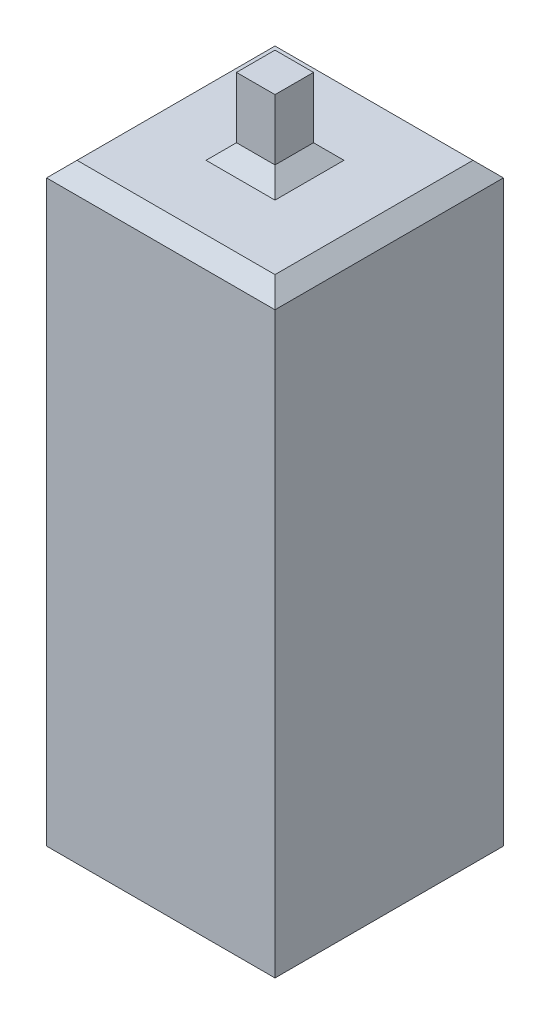
ISO-10303-21;
HEADER;
FILE_DESCRIPTION(('STEP AP214'),'2;1');
FILE_NAME('part.step','',(''),(''),'','','');
FILE_SCHEMA(('AUTOMOTIVE_DESIGN { 1 0 10303 214 1 1 1 1 }'));
ENDSEC;
DATA;
#1=APPLICATION_CONTEXT('core data for automotive mechanical design processes');
#2=APPLICATION_PROTOCOL_DEFINITION('international standard','automotive_design',2000,#1);
#3=PRODUCT_CONTEXT('',#1,'mechanical');
#4=PRODUCT('Part','Part','',(#3));
#5=PRODUCT_RELATED_PRODUCT_CATEGORY('part','',(#4));
#6=PRODUCT_DEFINITION_FORMATION('','',#4);
#7=PRODUCT_DEFINITION_CONTEXT('part definition',#1,'design');
#8=PRODUCT_DEFINITION('design','',#6,#7);
#9=PRODUCT_DEFINITION_SHAPE('','',#8);
#10=(LENGTH_UNIT() NAMED_UNIT(*) SI_UNIT(.MILLI.,.METRE.));
#11=(NAMED_UNIT(*) PLANE_ANGLE_UNIT() SI_UNIT($,.RADIAN.));
#12=(NAMED_UNIT(*) SI_UNIT($,.STERADIAN.) SOLID_ANGLE_UNIT());
#13=UNCERTAINTY_MEASURE_WITH_UNIT(LENGTH_MEASURE(1.E-05),#10,'distance_accuracy_value','');
#14=(GEOMETRIC_REPRESENTATION_CONTEXT(3) GLOBAL_UNCERTAINTY_ASSIGNED_CONTEXT((#13)) GLOBAL_UNIT_ASSIGNED_CONTEXT((#10,
#11,#12)) REPRESENTATION_CONTEXT('',''));
#15=CARTESIAN_POINT('',(0.,0.,0.));
#16=DIRECTION('',(0.,0.,1.));
#17=DIRECTION('',(1.,0.,0.));
#18=AXIS2_PLACEMENT_3D('',#15,#16,#17);
#19=CARTESIAN_POINT('',(150.,800.,-150.));
#20=DIRECTION('',(-1.,0.,0.));
#21=DIRECTION('',(0.,0.,1.));
#22=AXIS2_PLACEMENT_3D('',#19,#20,#21);
#23=PLANE('',#22);
#24=DIRECTION('',(0.,-1.,0.));
#25=VECTOR('',#24,1.);
#26=CARTESIAN_POINT('',(150.,800.,150.));
#27=LINE('',#26,#25);
#28=CARTESIAN_POINT('',(150.,780.,150.));
#29=VERTEX_POINT('',#28);
#30=CARTESIAN_POINT('',(150.,20.0000000000001,150.));
#31=VERTEX_POINT('',#30);
#32=EDGE_CURVE('E159',#29,#31,#27,.T.);
#33=ORIENTED_EDGE('',*,*,#32,.T.);
#34=DIRECTION('',(0.,0.,-1.));
#35=VECTOR('',#34,1.);
#36=CARTESIAN_POINT('',(150.,20.0000000000001,-150.));
#37=LINE('',#36,#35);
#38=CARTESIAN_POINT('',(150.,20.0000000000001,-150.));
#39=VERTEX_POINT('',#38);
#40=EDGE_CURVE('E201',#31,#39,#37,.T.);
#41=ORIENTED_EDGE('',*,*,#40,.T.);
#42=DIRECTION('',(0.,-1.,0.));
#43=VECTOR('',#42,1.);
#44=CARTESIAN_POINT('',(150.,800.,-150.));
#45=LINE('',#44,#43);
#46=CARTESIAN_POINT('',(150.,780.,-150.));
#47=VERTEX_POINT('',#46);
#48=EDGE_CURVE('E173',#47,#39,#45,.T.);
#49=ORIENTED_EDGE('',*,*,#48,.F.);
#50=DIRECTION('',(0.,0.,1.));
#51=VECTOR('',#50,1.);
#52=CARTESIAN_POINT('',(150.,780.,150.));
#53=LINE('',#52,#51);
#54=EDGE_CURVE('E199',#47,#29,#53,.T.);
#55=ORIENTED_EDGE('',*,*,#54,.T.);
#56=EDGE_LOOP('',(#33,#41,#49,#55));
#57=FACE_BOUND('',#56,.T.);
#58=ADVANCED_FACE('F33',(#57),#23,.F.);
#59=CARTESIAN_POINT('',(-150.,800.,-150.));
#60=DIRECTION('',(0.,0.,1.));
#61=DIRECTION('',(1.,0.,0.));
#62=AXIS2_PLACEMENT_3D('',#59,#60,#61);
#63=PLANE('',#62);
#64=ORIENTED_EDGE('',*,*,#48,.T.);
#65=DIRECTION('',(-1.,0.,0.));
#66=VECTOR('',#65,1.);
#67=CARTESIAN_POINT('',(-150.,20.0000000000001,-150.));
#68=LINE('',#67,#66);
#69=CARTESIAN_POINT('',(-150.,20.0000000000001,-150.));
#70=VERTEX_POINT('',#69);
#71=EDGE_CURVE('E178',#39,#70,#68,.T.);
#72=ORIENTED_EDGE('',*,*,#71,.T.);
#73=DIRECTION('',(0.,-1.,0.));
#74=VECTOR('',#73,1.);
#75=CARTESIAN_POINT('',(-150.,800.,-150.));
#76=LINE('',#75,#74);
#77=CARTESIAN_POINT('',(-150.,780.,-150.));
#78=VERTEX_POINT('',#77);
#79=EDGE_CURVE('E170',#78,#70,#76,.T.);
#80=ORIENTED_EDGE('',*,*,#79,.F.);
#81=DIRECTION('',(1.,0.,0.));
#82=VECTOR('',#81,1.);
#83=CARTESIAN_POINT('',(150.,780.,-150.));
#84=LINE('',#83,#82);
#85=EDGE_CURVE('E176',#78,#47,#84,.T.);
#86=ORIENTED_EDGE('',*,*,#85,.T.);
#87=EDGE_LOOP('',(#64,#72,#80,#86));
#88=FACE_BOUND('',#87,.T.);
#89=ADVANCED_FACE('F283',(#88),#63,.F.);
#90=CARTESIAN_POINT('',(-150.,800.,-150.));
#91=DIRECTION('',(1.,0.,0.));
#92=DIRECTION('',(0.,0.,-1.));
#93=AXIS2_PLACEMENT_3D('',#90,#91,#92);
#94=PLANE('',#93);
#95=ORIENTED_EDGE('',*,*,#79,.T.);
#96=DIRECTION('',(0.,0.,1.));
#97=VECTOR('',#96,1.);
#98=CARTESIAN_POINT('',(-150.,20.0000000000001,-150.));
#99=LINE('',#98,#97);
#100=CARTESIAN_POINT('',(-150.,20.0000000000001,150.));
#101=VERTEX_POINT('',#100);
#102=EDGE_CURVE('E192',#70,#101,#99,.T.);
#103=ORIENTED_EDGE('',*,*,#102,.T.);
#104=DIRECTION('',(0.,-1.,0.));
#105=VECTOR('',#104,1.);
#106=CARTESIAN_POINT('',(-150.,800.,150.));
#107=LINE('',#106,#105);
#108=CARTESIAN_POINT('',(-150.,780.,150.));
#109=VERTEX_POINT('',#108);
#110=EDGE_CURVE('E162',#109,#101,#107,.T.);
#111=ORIENTED_EDGE('',*,*,#110,.F.);
#112=DIRECTION('',(0.,0.,-1.));
#113=VECTOR('',#112,1.);
#114=CARTESIAN_POINT('',(-150.,780.,-150.));
#115=LINE('',#114,#113);
#116=EDGE_CURVE('E190',#109,#78,#115,.T.);
#117=ORIENTED_EDGE('',*,*,#116,.T.);
#118=EDGE_LOOP('',(#95,#103,#111,#117));
#119=FACE_BOUND('',#118,.T.);
#120=ADVANCED_FACE('F289',(#119),#94,.F.);
#121=CARTESIAN_POINT('',(-150.,800.,150.));
#122=DIRECTION('',(0.,0.,-1.));
#123=DIRECTION('',(-1.,0.,0.));
#124=AXIS2_PLACEMENT_3D('',#121,#122,#123);
#125=PLANE('',#124);
#126=ORIENTED_EDGE('',*,*,#110,.T.);
#127=DIRECTION('',(1.,0.,0.));
#128=VECTOR('',#127,1.);
#129=CARTESIAN_POINT('',(-150.,20.0000000000001,150.));
#130=LINE('',#129,#128);
#131=EDGE_CURVE('E197',#101,#31,#130,.T.);
#132=ORIENTED_EDGE('',*,*,#131,.T.);
#133=ORIENTED_EDGE('',*,*,#32,.F.);
#134=DIRECTION('',(-1.,0.,0.));
#135=VECTOR('',#134,1.);
#136=CARTESIAN_POINT('',(-150.,780.,150.));
#137=LINE('',#136,#135);
#138=EDGE_CURVE('E194',#29,#109,#137,.T.);
#139=ORIENTED_EDGE('',*,*,#138,.T.);
#140=EDGE_LOOP('',(#126,#132,#133,#139));
#141=FACE_BOUND('',#140,.T.);
#142=ADVANCED_FACE('F390',(#141),#125,.F.);
#143=CARTESIAN_POINT('',(0.,800.,0.));
#144=DIRECTION('',(0.,1.,0.));
#145=DIRECTION('',(0.,0.,1.));
#146=AXIS2_PLACEMENT_3D('',#143,#144,#145);
#147=PLANE('',#146);
#148=DIRECTION('',(0.,0.,1.));
#149=VECTOR('',#148,1.);
#150=CARTESIAN_POINT('',(-130.,800.,150.));
#151=LINE('',#150,#149);
#152=CARTESIAN_POINT('',(-130.,800.,-130.));
#153=VERTEX_POINT('',#152);
#154=CARTESIAN_POINT('',(-130.,800.,130.));
#155=VERTEX_POINT('',#154);
#156=EDGE_CURVE('E216',#153,#155,#151,.T.);
#157=ORIENTED_EDGE('',*,*,#156,.T.);
#158=DIRECTION('',(1.,0.,0.));
#159=VECTOR('',#158,1.);
#160=CARTESIAN_POINT('',(150.,800.,130.));
#161=LINE('',#160,#159);
#162=CARTESIAN_POINT('',(130.,800.,130.));
#163=VERTEX_POINT('',#162);
#164=EDGE_CURVE('E218',#155,#163,#161,.T.);
#165=ORIENTED_EDGE('',*,*,#164,.T.);
#166=DIRECTION('',(0.,0.,-1.));
#167=VECTOR('',#166,1.);
#168=CARTESIAN_POINT('',(130.,800.,-150.));
#169=LINE('',#168,#167);
#170=CARTESIAN_POINT('',(130.,800.,-130.));
#171=VERTEX_POINT('',#170);
#172=EDGE_CURVE('E212',#163,#171,#169,.T.);
#173=ORIENTED_EDGE('',*,*,#172,.T.);
#174=DIRECTION('',(-1.,0.,0.));
#175=VECTOR('',#174,1.);
#176=CARTESIAN_POINT('',(-150.,800.,-130.));
#177=LINE('',#176,#175);
#178=EDGE_CURVE('E214',#171,#153,#177,.T.);
#179=ORIENTED_EDGE('',*,*,#178,.T.);
#180=EDGE_LOOP('',(#157,#165,#173,#179));
#181=FACE_BOUND('',#180,.T.);
#182=DIRECTION('',(0.,0.,-1.));
#183=VECTOR('',#182,1.);
#184=CARTESIAN_POINT('',(-45.2983842453178,800.,0.));
#185=LINE('',#184,#183);
#186=CARTESIAN_POINT('',(-45.2983842453178,800.,45.2983842453178));
#187=VERTEX_POINT('',#186);
#188=CARTESIAN_POINT('',(-45.2983842453178,800.,-45.2983842453178));
#189=VERTEX_POINT('',#188);
#190=EDGE_CURVE('E207',#187,#189,#185,.T.);
#191=ORIENTED_EDGE('',*,*,#190,.T.);
#192=DIRECTION('',(1.,0.,0.));
#193=VECTOR('',#192,1.);
#194=CARTESIAN_POINT('',(0.,800.,-45.2983842453178));
#195=LINE('',#194,#193);
#196=CARTESIAN_POINT('',(45.2983842453178,800.,-45.2983842453178));
#197=VERTEX_POINT('',#196);
#198=EDGE_CURVE('E209',#189,#197,#195,.T.);
#199=ORIENTED_EDGE('',*,*,#198,.T.);
#200=DIRECTION('',(0.,0.,1.));
#201=VECTOR('',#200,1.);
#202=CARTESIAN_POINT('',(45.2983842453178,800.,0.));
#203=LINE('',#202,#201);
#204=CARTESIAN_POINT('',(45.2983842453178,800.,45.2983842453178));
#205=VERTEX_POINT('',#204);
#206=EDGE_CURVE('E203',#197,#205,#203,.T.);
#207=ORIENTED_EDGE('',*,*,#206,.T.);
#208=DIRECTION('',(-1.,0.,0.));
#209=VECTOR('',#208,1.);
#210=CARTESIAN_POINT('',(0.,800.,45.2983842453178));
#211=LINE('',#210,#209);
#212=EDGE_CURVE('E205',#205,#187,#211,.T.);
#213=ORIENTED_EDGE('',*,*,#212,.T.);
#214=EDGE_LOOP('',(#191,#199,#207,#213));
#215=FACE_BOUND('',#214,.T.);
#216=ADVANCED_FACE('F260',(#181,#215),#147,.T.);
#217=CARTESIAN_POINT('',(0.,0.,0.));
#218=DIRECTION('',(0.,1.,0.));
#219=DIRECTION('',(0.,0.,1.));
#220=AXIS2_PLACEMENT_3D('',#217,#218,#219);
#221=PLANE('',#220);
#222=DIRECTION('',(0.,0.,-1.));
#223=VECTOR('',#222,1.);
#224=CARTESIAN_POINT('',(-130.,0.,0.));
#225=LINE('',#224,#223);
#226=CARTESIAN_POINT('',(-130.,0.,130.));
#227=VERTEX_POINT('',#226);
#228=CARTESIAN_POINT('',(-130.,0.,-130.));
#229=VERTEX_POINT('',#228);
#230=EDGE_CURVE('E185',#227,#229,#225,.T.);
#231=ORIENTED_EDGE('',*,*,#230,.T.);
#232=DIRECTION('',(1.,0.,0.));
#233=VECTOR('',#232,1.);
#234=CARTESIAN_POINT('',(0.,0.,-130.));
#235=LINE('',#234,#233);
#236=CARTESIAN_POINT('',(130.,0.,-130.));
#237=VERTEX_POINT('',#236);
#238=EDGE_CURVE('E187',#229,#237,#235,.T.);
#239=ORIENTED_EDGE('',*,*,#238,.T.);
#240=DIRECTION('',(0.,0.,1.));
#241=VECTOR('',#240,1.);
#242=CARTESIAN_POINT('',(130.,0.,0.));
#243=LINE('',#242,#241);
#244=CARTESIAN_POINT('',(130.,0.,130.));
#245=VERTEX_POINT('',#244);
#246=EDGE_CURVE('E181',#237,#245,#243,.T.);
#247=ORIENTED_EDGE('',*,*,#246,.T.);
#248=DIRECTION('',(-1.,0.,0.));
#249=VECTOR('',#248,1.);
#250=CARTESIAN_POINT('',(0.,0.,130.));
#251=LINE('',#250,#249);
#252=EDGE_CURVE('E183',#245,#227,#251,.T.);
#253=ORIENTED_EDGE('',*,*,#252,.T.);
#254=EDGE_LOOP('',(#231,#239,#247,#253));
#255=FACE_BOUND('',#254,.T.);
#256=ADVANCED_FACE('F408',(#255),#221,.F.);
#257=CARTESIAN_POINT('',(25.2983842453178,900.,-25.2983842453178));
#258=DIRECTION('',(-1.,0.,0.));
#259=DIRECTION('',(0.,0.,1.));
#260=AXIS2_PLACEMENT_3D('',#257,#258,#259);
#261=PLANE('',#260);
#262=DIRECTION('',(0.,-1.,0.));
#263=VECTOR('',#262,1.);
#264=CARTESIAN_POINT('',(25.2983842453178,900.,25.2983842453178));
#265=LINE('',#264,#263);
#266=CARTESIAN_POINT('',(25.2983842453178,900.,25.2983842453178));
#267=VERTEX_POINT('',#266);
#268=CARTESIAN_POINT('',(25.2983842453178,820.,25.2983842453178));
#269=VERTEX_POINT('',#268);
#270=EDGE_CURVE('E269',#267,#269,#265,.T.);
#271=ORIENTED_EDGE('',*,*,#270,.T.);
#272=DIRECTION('',(0.,0.,-1.));
#273=VECTOR('',#272,1.);
#274=CARTESIAN_POINT('',(25.2983842453178,820.,-25.2983842453178));
#275=LINE('',#274,#273);
#276=CARTESIAN_POINT('',(25.2983842453178,820.,-25.2983842453178));
#277=VERTEX_POINT('',#276);
#278=EDGE_CURVE('E11',#269,#277,#275,.T.);
#279=ORIENTED_EDGE('',*,*,#278,.T.);
#280=DIRECTION('',(0.,-1.,0.));
#281=VECTOR('',#280,1.);
#282=CARTESIAN_POINT('',(25.2983842453178,900.,-25.2983842453178));
#283=LINE('',#282,#281);
#284=CARTESIAN_POINT('',(25.2983842453178,900.,-25.2983842453178));
#285=VERTEX_POINT('',#284);
#286=EDGE_CURVE('E142',#285,#277,#283,.T.);
#287=ORIENTED_EDGE('',*,*,#286,.F.);
#288=DIRECTION('',(0.,0.,-1.));
#289=VECTOR('',#288,1.);
#290=CARTESIAN_POINT('',(25.2983842453178,900.,-25.2983842453178));
#291=LINE('',#290,#289);
#292=EDGE_CURVE('E148',#267,#285,#291,.T.);
#293=ORIENTED_EDGE('',*,*,#292,.F.);
#294=EDGE_LOOP('',(#271,#279,#287,#293));
#295=FACE_BOUND('',#294,.T.);
#296=ADVANCED_FACE('F157',(#295),#261,.F.);
#297=CARTESIAN_POINT('',(-25.2983842453178,900.,-25.2983842453178));
#298=DIRECTION('',(0.,0.,1.));
#299=DIRECTION('',(1.,0.,0.));
#300=AXIS2_PLACEMENT_3D('',#297,#298,#299);
#301=PLANE('',#300);
#302=ORIENTED_EDGE('',*,*,#286,.T.);
#303=DIRECTION('',(-1.,0.,0.));
#304=VECTOR('',#303,1.);
#305=CARTESIAN_POINT('',(-25.2983842453178,820.,-25.2983842453178));
#306=LINE('',#305,#304);
#307=CARTESIAN_POINT('',(-25.2983842453178,820.,-25.2983842453178));
#308=VERTEX_POINT('',#307);
#309=EDGE_CURVE('E221',#277,#308,#306,.T.);
#310=ORIENTED_EDGE('',*,*,#309,.T.);
#311=DIRECTION('',(0.,-1.,0.));
#312=VECTOR('',#311,1.);
#313=CARTESIAN_POINT('',(-25.2983842453178,900.,-25.2983842453178));
#314=LINE('',#313,#312);
#315=CARTESIAN_POINT('',(-25.2983842453178,900.,-25.2983842453178));
#316=VERTEX_POINT('',#315);
#317=EDGE_CURVE('E144',#316,#308,#314,.T.);
#318=ORIENTED_EDGE('',*,*,#317,.F.);
#319=DIRECTION('',(-1.,0.,0.));
#320=VECTOR('',#319,1.);
#321=CARTESIAN_POINT('',(-25.2983842453178,900.,-25.2983842453178));
#322=LINE('',#321,#320);
#323=EDGE_CURVE('E137',#285,#316,#322,.T.);
#324=ORIENTED_EDGE('',*,*,#323,.F.);
#325=EDGE_LOOP('',(#302,#310,#318,#324));
#326=FACE_BOUND('',#325,.T.);
#327=ADVANCED_FACE('F139',(#326),#301,.F.);
#328=CARTESIAN_POINT('',(-25.2983842453178,900.,-25.2983842453178));
#329=DIRECTION('',(1.,0.,0.));
#330=DIRECTION('',(0.,0.,-1.));
#331=AXIS2_PLACEMENT_3D('',#328,#329,#330);
#332=PLANE('',#331);
#333=ORIENTED_EDGE('',*,*,#317,.T.);
#334=DIRECTION('',(0.,0.,1.));
#335=VECTOR('',#334,1.);
#336=CARTESIAN_POINT('',(-25.2983842453178,820.,-25.2983842453178));
#337=LINE('',#336,#335);
#338=CARTESIAN_POINT('',(-25.2983842453178,820.,25.2983842453178));
#339=VERTEX_POINT('',#338);
#340=EDGE_CURVE('E57',#308,#339,#337,.T.);
#341=ORIENTED_EDGE('',*,*,#340,.T.);
#342=DIRECTION('',(0.,-1.,0.));
#343=VECTOR('',#342,1.);
#344=CARTESIAN_POINT('',(-25.2983842453178,900.,25.2983842453178));
#345=LINE('',#344,#343);
#346=CARTESIAN_POINT('',(-25.2983842453178,900.,25.2983842453178));
#347=VERTEX_POINT('',#346);
#348=EDGE_CURVE('E164',#347,#339,#345,.T.);
#349=ORIENTED_EDGE('',*,*,#348,.F.);
#350=DIRECTION('',(0.,0.,1.));
#351=VECTOR('',#350,1.);
#352=CARTESIAN_POINT('',(-25.2983842453178,900.,-25.2983842453178));
#353=LINE('',#352,#351);
#354=EDGE_CURVE('E147',#316,#347,#353,.T.);
#355=ORIENTED_EDGE('',*,*,#354,.F.);
#356=EDGE_LOOP('',(#333,#341,#349,#355));
#357=FACE_BOUND('',#356,.T.);
#358=ADVANCED_FACE('F267',(#357),#332,.F.);
#359=CARTESIAN_POINT('',(-25.2983842453178,900.,25.2983842453178));
#360=DIRECTION('',(0.,0.,-1.));
#361=DIRECTION('',(-1.,0.,0.));
#362=AXIS2_PLACEMENT_3D('',#359,#360,#361);
#363=PLANE('',#362);
#364=ORIENTED_EDGE('',*,*,#348,.T.);
#365=DIRECTION('',(1.,0.,0.));
#366=VECTOR('',#365,1.);
#367=CARTESIAN_POINT('',(-25.2983842453178,820.,25.2983842453178));
#368=LINE('',#367,#366);
#369=EDGE_CURVE('E42',#339,#269,#368,.T.);
#370=ORIENTED_EDGE('',*,*,#369,.T.);
#371=ORIENTED_EDGE('',*,*,#270,.F.);
#372=DIRECTION('',(1.,0.,0.));
#373=VECTOR('',#372,1.);
#374=CARTESIAN_POINT('',(-25.2983842453178,900.,25.2983842453178));
#375=LINE('',#374,#373);
#376=EDGE_CURVE('E153',#347,#267,#375,.T.);
#377=ORIENTED_EDGE('',*,*,#376,.F.);
#378=EDGE_LOOP('',(#364,#370,#371,#377));
#379=FACE_BOUND('',#378,.T.);
#380=ADVANCED_FACE('F272',(#379),#363,.F.);
#381=CARTESIAN_POINT('',(0.,900.,0.));
#382=DIRECTION('',(0.,1.,0.));
#383=DIRECTION('',(0.,0.,1.));
#384=AXIS2_PLACEMENT_3D('',#381,#382,#383);
#385=PLANE('',#384);
#386=ORIENTED_EDGE('',*,*,#292,.T.);
#387=ORIENTED_EDGE('',*,*,#323,.T.);
#388=ORIENTED_EDGE('',*,*,#354,.T.);
#389=ORIENTED_EDGE('',*,*,#376,.T.);
#390=EDGE_LOOP('',(#386,#387,#388,#389));
#391=FACE_BOUND('',#390,.T.);
#392=ADVANCED_FACE('F151',(#391),#385,.T.);
#393=CARTESIAN_POINT('',(-150.,20.0000000000001,150.));
#394=DIRECTION('',(0.,0.707106781186549,-0.707106781186546));
#395=DIRECTION('',(1.,0.,0.));
#396=AXIS2_PLACEMENT_3D('',#393,#394,#395);
#397=PLANE('',#396);
#398=DIRECTION('',(0.577350269189627,-0.577350269189624,-0.577350269189627));
#399=VECTOR('',#398,1.);
#400=CARTESIAN_POINT('',(-150.,20.0000000000001,150.));
#401=LINE('',#400,#399);
#402=EDGE_CURVE('E230',#227,#101,#401,.F.);
#403=ORIENTED_EDGE('',*,*,#402,.F.);
#404=ORIENTED_EDGE('',*,*,#252,.F.);
#405=DIRECTION('',(-0.577350269189626,-0.577350269189624,-0.577350269189627));
#406=VECTOR('',#405,1.);
#407=CARTESIAN_POINT('',(49.9999999999997,-79.9999999999998,49.9999999999995));
#408=LINE('',#407,#406);
#409=EDGE_CURVE('E155',#31,#245,#408,.T.);
#410=ORIENTED_EDGE('',*,*,#409,.F.);
#411=ORIENTED_EDGE('',*,*,#131,.F.);
#412=EDGE_LOOP('',(#403,#404,#410,#411));
#413=FACE_BOUND('',#412,.T.);
#414=ADVANCED_FACE('F279',(#413),#397,.F.);
#415=CARTESIAN_POINT('',(150.,20.0000000000001,-150.));
#416=DIRECTION('',(-0.707106781186546,0.707106781186549,0.));
#417=DIRECTION('',(0.,0.,-1.));
#418=AXIS2_PLACEMENT_3D('',#415,#416,#417);
#419=PLANE('',#418);
#420=ORIENTED_EDGE('',*,*,#409,.T.);
#421=ORIENTED_EDGE('',*,*,#246,.F.);
#422=DIRECTION('',(0.577350269189626,0.577350269189624,-0.577350269189627));
#423=VECTOR('',#422,1.);
#424=CARTESIAN_POINT('',(150.,20.0000000000001,-150.));
#425=LINE('',#424,#423);
#426=EDGE_CURVE('E227',#39,#237,#425,.F.);
#427=ORIENTED_EDGE('',*,*,#426,.F.);
#428=ORIENTED_EDGE('',*,*,#40,.F.);
#429=EDGE_LOOP('',(#420,#421,#427,#428));
#430=FACE_BOUND('',#429,.T.);
#431=ADVANCED_FACE('F302',(#430),#419,.F.);
#432=CARTESIAN_POINT('',(-150.,20.0000000000001,-150.));
#433=DIRECTION('',(0.707106781186546,0.707106781186549,0.));
#434=DIRECTION('',(0.,0.,1.));
#435=AXIS2_PLACEMENT_3D('',#432,#433,#434);
#436=PLANE('',#435);
#437=ORIENTED_EDGE('',*,*,#402,.T.);
#438=ORIENTED_EDGE('',*,*,#102,.F.);
#439=DIRECTION('',(0.577350269189627,-0.577350269189624,0.577350269189627));
#440=VECTOR('',#439,1.);
#441=CARTESIAN_POINT('',(-150.,20.0000000000001,-150.));
#442=LINE('',#441,#440);
#443=EDGE_CURVE('E225',#229,#70,#442,.F.);
#444=ORIENTED_EDGE('',*,*,#443,.F.);
#445=ORIENTED_EDGE('',*,*,#230,.F.);
#446=EDGE_LOOP('',(#437,#438,#444,#445));
#447=FACE_BOUND('',#446,.T.);
#448=ADVANCED_FACE('F298',(#447),#436,.F.);
#449=CARTESIAN_POINT('',(-150.,20.0000000000001,-150.));
#450=DIRECTION('',(0.,0.707106781186549,0.707106781186546));
#451=DIRECTION('',(-1.,0.,0.));
#452=AXIS2_PLACEMENT_3D('',#449,#450,#451);
#453=PLANE('',#452);
#454=ORIENTED_EDGE('',*,*,#426,.T.);
#455=ORIENTED_EDGE('',*,*,#238,.F.);
#456=ORIENTED_EDGE('',*,*,#443,.T.);
#457=ORIENTED_EDGE('',*,*,#71,.F.);
#458=EDGE_LOOP('',(#454,#455,#456,#457));
#459=FACE_BOUND('',#458,.T.);
#460=ADVANCED_FACE('F294',(#459),#453,.F.);
#461=CARTESIAN_POINT('',(0.,800.,-130.));
#462=DIRECTION('',(0.,0.707106781186548,-0.707106781186548));
#463=DIRECTION('',(1.,0.,0.));
#464=AXIS2_PLACEMENT_3D('',#461,#462,#463);
#465=PLANE('',#464);
#466=DIRECTION('',(-0.577350269189625,0.577350269189626,0.577350269189626));
#467=VECTOR('',#466,1.);
#468=CARTESIAN_POINT('',(86.6666666666668,843.333333333333,-86.6666666666667));
#469=LINE('',#468,#467);
#470=EDGE_CURVE('E239',#47,#171,#469,.T.);
#471=ORIENTED_EDGE('',*,*,#470,.F.);
#472=ORIENTED_EDGE('',*,*,#85,.F.);
#473=DIRECTION('',(0.577350269189626,0.577350269189626,0.577350269189626));
#474=VECTOR('',#473,1.);
#475=CARTESIAN_POINT('',(-86.6666666666667,843.333333333333,-86.6666666666668));
#476=LINE('',#475,#474);
#477=EDGE_CURVE('E228',#153,#78,#476,.F.);
#478=ORIENTED_EDGE('',*,*,#477,.F.);
#479=ORIENTED_EDGE('',*,*,#178,.F.);
#480=EDGE_LOOP('',(#471,#472,#478,#479));
#481=FACE_BOUND('',#480,.T.);
#482=ADVANCED_FACE('F297',(#481),#465,.T.);
#483=CARTESIAN_POINT('',(-130.,800.,0.));
#484=DIRECTION('',(-0.707106781186548,0.707106781186548,0.));
#485=DIRECTION('',(0.,0.,-1.));
#486=AXIS2_PLACEMENT_3D('',#483,#484,#485);
#487=PLANE('',#486);
#488=ORIENTED_EDGE('',*,*,#477,.T.);
#489=ORIENTED_EDGE('',*,*,#116,.F.);
#490=DIRECTION('',(0.577350269189626,0.577350269189626,-0.577350269189626));
#491=VECTOR('',#490,1.);
#492=CARTESIAN_POINT('',(-86.6666666666667,843.333333333333,86.6666666666667));
#493=LINE('',#492,#491);
#494=EDGE_CURVE('E237',#155,#109,#493,.F.);
#495=ORIENTED_EDGE('',*,*,#494,.F.);
#496=ORIENTED_EDGE('',*,*,#156,.F.);
#497=EDGE_LOOP('',(#488,#489,#495,#496));
#498=FACE_BOUND('',#497,.T.);
#499=ADVANCED_FACE('F317',(#498),#487,.T.);
#500=CARTESIAN_POINT('',(130.,800.,0.));
#501=DIRECTION('',(0.707106781186548,0.707106781186547,0.));
#502=DIRECTION('',(0.,0.,1.));
#503=AXIS2_PLACEMENT_3D('',#500,#501,#502);
#504=PLANE('',#503);
#505=ORIENTED_EDGE('',*,*,#470,.T.);
#506=ORIENTED_EDGE('',*,*,#172,.F.);
#507=DIRECTION('',(0.577350269189625,-0.577350269189626,0.577350269189626));
#508=VECTOR('',#507,1.);
#509=CARTESIAN_POINT('',(86.6666666666668,843.333333333333,86.6666666666666));
#510=LINE('',#509,#508);
#511=EDGE_CURVE('E235',#29,#163,#510,.F.);
#512=ORIENTED_EDGE('',*,*,#511,.F.);
#513=ORIENTED_EDGE('',*,*,#54,.F.);
#514=EDGE_LOOP('',(#505,#506,#512,#513));
#515=FACE_BOUND('',#514,.T.);
#516=ADVANCED_FACE('F313',(#515),#504,.T.);
#517=CARTESIAN_POINT('',(0.,800.,130.));
#518=DIRECTION('',(0.,0.707106781186548,0.707106781186548));
#519=DIRECTION('',(-1.,0.,0.));
#520=AXIS2_PLACEMENT_3D('',#517,#518,#519);
#521=PLANE('',#520);
#522=ORIENTED_EDGE('',*,*,#494,.T.);
#523=ORIENTED_EDGE('',*,*,#138,.F.);
#524=ORIENTED_EDGE('',*,*,#511,.T.);
#525=ORIENTED_EDGE('',*,*,#164,.F.);
#526=EDGE_LOOP('',(#522,#523,#524,#525));
#527=FACE_BOUND('',#526,.T.);
#528=ADVANCED_FACE('F310',(#527),#521,.T.);
#529=CARTESIAN_POINT('',(-25.2983842453178,820.,25.2983842453178));
#530=DIRECTION('',(0.,-0.707106781186543,-0.707106781186551));
#531=DIRECTION('',(1.,0.,0.));
#532=AXIS2_PLACEMENT_3D('',#529,#530,#531);
#533=PLANE('',#532);
#534=DIRECTION('',(-0.577350269189624,-0.57735026918963,0.577350269189624));
#535=VECTOR('',#534,1.);
#536=CARTESIAN_POINT('',(-25.2983842453178,820.,25.2983842453178));
#537=LINE('',#536,#535);
#538=EDGE_CURVE('E247',#187,#339,#537,.F.);
#539=ORIENTED_EDGE('',*,*,#538,.F.);
#540=ORIENTED_EDGE('',*,*,#212,.F.);
#541=DIRECTION('',(0.577350269189624,-0.57735026918963,0.577350269189624));
#542=VECTOR('',#541,1.);
#543=CARTESIAN_POINT('',(8.4327947484394,836.865589496879,8.4327947484394));
#544=LINE('',#543,#542);
#545=EDGE_CURVE('E37',#269,#205,#544,.T.);
#546=ORIENTED_EDGE('',*,*,#545,.F.);
#547=ORIENTED_EDGE('',*,*,#369,.F.);
#548=EDGE_LOOP('',(#539,#540,#546,#547));
#549=FACE_BOUND('',#548,.T.);
#550=ADVANCED_FACE('F35',(#549),#533,.F.);
#551=CARTESIAN_POINT('',(25.2983842453178,820.,-25.2983842453178));
#552=DIRECTION('',(-0.707106781186551,-0.707106781186543,0.));
#553=DIRECTION('',(0.,0.,-1.));
#554=AXIS2_PLACEMENT_3D('',#551,#552,#553);
#555=PLANE('',#554);
#556=ORIENTED_EDGE('',*,*,#545,.T.);
#557=ORIENTED_EDGE('',*,*,#206,.F.);
#558=DIRECTION('',(-0.577350269189624,0.57735026918963,0.577350269189624));
#559=VECTOR('',#558,1.);
#560=CARTESIAN_POINT('',(25.2983842453178,820.,-25.2983842453178));
#561=LINE('',#560,#559);
#562=EDGE_CURVE('E246',#277,#197,#561,.F.);
#563=ORIENTED_EDGE('',*,*,#562,.F.);
#564=ORIENTED_EDGE('',*,*,#278,.F.);
#565=EDGE_LOOP('',(#556,#557,#563,#564));
#566=FACE_BOUND('',#565,.T.);
#567=ADVANCED_FACE('F256',(#566),#555,.F.);
#568=CARTESIAN_POINT('',(-25.2983842453178,820.,-25.2983842453178));
#569=DIRECTION('',(0.707106781186551,-0.707106781186543,0.));
#570=DIRECTION('',(0.,0.,1.));
#571=AXIS2_PLACEMENT_3D('',#568,#569,#570);
#572=PLANE('',#571);
#573=ORIENTED_EDGE('',*,*,#538,.T.);
#574=ORIENTED_EDGE('',*,*,#340,.F.);
#575=DIRECTION('',(-0.577350269189624,-0.57735026918963,-0.577350269189624));
#576=VECTOR('',#575,1.);
#577=CARTESIAN_POINT('',(-25.2983842453178,820.,-25.2983842453178));
#578=LINE('',#577,#576);
#579=EDGE_CURVE('E244',#189,#308,#578,.F.);
#580=ORIENTED_EDGE('',*,*,#579,.F.);
#581=ORIENTED_EDGE('',*,*,#190,.F.);
#582=EDGE_LOOP('',(#573,#574,#580,#581));
#583=FACE_BOUND('',#582,.T.);
#584=ADVANCED_FACE('F266',(#583),#572,.F.);
#585=CARTESIAN_POINT('',(-25.2983842453178,820.,-25.2983842453178));
#586=DIRECTION('',(0.,-0.707106781186543,0.707106781186551));
#587=DIRECTION('',(-1.,0.,0.));
#588=AXIS2_PLACEMENT_3D('',#585,#586,#587);
#589=PLANE('',#588);
#590=ORIENTED_EDGE('',*,*,#562,.T.);
#591=ORIENTED_EDGE('',*,*,#198,.F.);
#592=ORIENTED_EDGE('',*,*,#579,.T.);
#593=ORIENTED_EDGE('',*,*,#309,.F.);
#594=EDGE_LOOP('',(#590,#591,#592,#593));
#595=FACE_BOUND('',#594,.T.);
#596=ADVANCED_FACE('F264',(#595),#589,.F.);
#597=CLOSED_SHELL('',(#58,#89,#120,#142,#216,#256,#296,#327,#358,#380,#392,#414,#431,#448,#460,
#482,#499,#516,#528,#550,#567,#584,#596));
#598=MANIFOLD_SOLID_BREP('B2',#597);
#599=ADVANCED_BREP_SHAPE_REPRESENTATION('',(#18,#598),#14);
#600=SHAPE_DEFINITION_REPRESENTATION(#9,#599);
ENDSEC;
END-ISO-10303-21;
